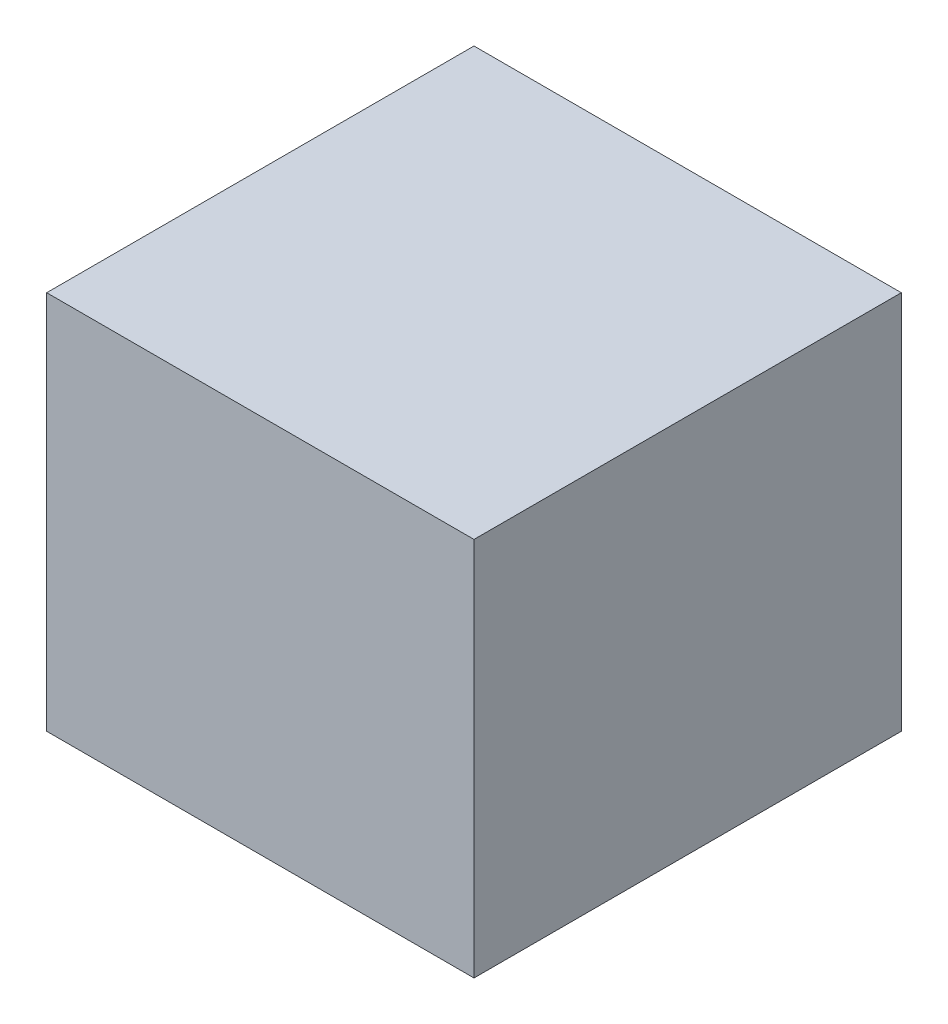
ISO-10303-21;
HEADER;
FILE_DESCRIPTION(('STEP AP214'),'2;1');
FILE_NAME('part.step','',(''),(''),'','','');
FILE_SCHEMA(('AUTOMOTIVE_DESIGN { 1 0 10303 214 1 1 1 1 }'));
ENDSEC;
DATA;
#1=APPLICATION_CONTEXT('core data for automotive mechanical design processes');
#2=APPLICATION_PROTOCOL_DEFINITION('international standard','automotive_design',2000,#1);
#3=PRODUCT_CONTEXT('',#1,'mechanical');
#4=PRODUCT('Part','Part','',(#3));
#5=PRODUCT_RELATED_PRODUCT_CATEGORY('part','',(#4));
#6=PRODUCT_DEFINITION_FORMATION('','',#4);
#7=PRODUCT_DEFINITION_CONTEXT('part definition',#1,'design');
#8=PRODUCT_DEFINITION('design','',#6,#7);
#9=PRODUCT_DEFINITION_SHAPE('','',#8);
#10=(LENGTH_UNIT() NAMED_UNIT(*) SI_UNIT(.MILLI.,.METRE.));
#11=(NAMED_UNIT(*) PLANE_ANGLE_UNIT() SI_UNIT($,.RADIAN.));
#12=(NAMED_UNIT(*) SI_UNIT($,.STERADIAN.) SOLID_ANGLE_UNIT());
#13=UNCERTAINTY_MEASURE_WITH_UNIT(LENGTH_MEASURE(1.E-05),#10,'distance_accuracy_value','');
#14=(GEOMETRIC_REPRESENTATION_CONTEXT(3) GLOBAL_UNCERTAINTY_ASSIGNED_CONTEXT((#13)) GLOBAL_UNIT_ASSIGNED_CONTEXT((#10,
#11,#12)) REPRESENTATION_CONTEXT('',''));
#15=CARTESIAN_POINT('',(0.,0.,0.));
#16=DIRECTION('',(0.,0.,1.));
#17=DIRECTION('',(1.,0.,0.));
#18=AXIS2_PLACEMENT_3D('',#15,#16,#17);
#19=CARTESIAN_POINT('',(0.,160.,-180.));
#20=DIRECTION('',(1.,0.,0.));
#21=DIRECTION('',(0.,0.,-1.));
#22=AXIS2_PLACEMENT_3D('',#19,#20,#21);
#23=PLANE('',#22);
#24=DIRECTION('',(0.,0.,1.));
#25=VECTOR('',#24,1.);
#26=CARTESIAN_POINT('',(0.,0.,-180.));
#27=LINE('',#26,#25);
#28=CARTESIAN_POINT('',(0.,0.,-180.));
#29=VERTEX_POINT('',#28);
#30=CARTESIAN_POINT('',(0.,0.,0.));
#31=VERTEX_POINT('',#30);
#32=EDGE_CURVE('E113',#29,#31,#27,.T.);
#33=ORIENTED_EDGE('',*,*,#32,.T.);
#34=DIRECTION('',(0.,-1.,0.));
#35=VECTOR('',#34,1.);
#36=CARTESIAN_POINT('',(0.,160.,0.));
#37=LINE('',#36,#35);
#38=CARTESIAN_POINT('',(0.,160.,0.));
#39=VERTEX_POINT('',#38);
#40=EDGE_CURVE('E11',#39,#31,#37,.T.);
#41=ORIENTED_EDGE('',*,*,#40,.F.);
#42=DIRECTION('',(0.,0.,1.));
#43=VECTOR('',#42,1.);
#44=CARTESIAN_POINT('',(0.,160.,-180.));
#45=LINE('',#44,#43);
#46=CARTESIAN_POINT('',(0.,160.,-180.));
#47=VERTEX_POINT('',#46);
#48=EDGE_CURVE('E97',#47,#39,#45,.T.);
#49=ORIENTED_EDGE('',*,*,#48,.F.);
#50=DIRECTION('',(0.,-1.,0.));
#51=VECTOR('',#50,1.);
#52=CARTESIAN_POINT('',(0.,160.,-180.));
#53=LINE('',#52,#51);
#54=EDGE_CURVE('E109',#47,#29,#53,.T.);
#55=ORIENTED_EDGE('',*,*,#54,.T.);
#56=EDGE_LOOP('',(#33,#41,#49,#55));
#57=FACE_BOUND('',#56,.T.);
#58=ADVANCED_FACE('F45',(#57),#23,.F.);
#59=CARTESIAN_POINT('',(0.,160.,0.));
#60=DIRECTION('',(0.,0.,-1.));
#61=DIRECTION('',(-1.,0.,0.));
#62=AXIS2_PLACEMENT_3D('',#59,#60,#61);
#63=PLANE('',#62);
#64=DIRECTION('',(1.,0.,0.));
#65=VECTOR('',#64,1.);
#66=CARTESIAN_POINT('',(0.,0.,0.));
#67=LINE('',#66,#65);
#68=CARTESIAN_POINT('',(180.,0.,0.));
#69=VERTEX_POINT('',#68);
#70=EDGE_CURVE('E102',#31,#69,#67,.T.);
#71=ORIENTED_EDGE('',*,*,#70,.T.);
#72=DIRECTION('',(0.,-1.,0.));
#73=VECTOR('',#72,1.);
#74=CARTESIAN_POINT('',(180.,160.,0.));
#75=LINE('',#74,#73);
#76=CARTESIAN_POINT('',(180.,160.,0.));
#77=VERTEX_POINT('',#76);
#78=EDGE_CURVE('E54',#77,#69,#75,.T.);
#79=ORIENTED_EDGE('',*,*,#78,.F.);
#80=DIRECTION('',(1.,0.,0.));
#81=VECTOR('',#80,1.);
#82=CARTESIAN_POINT('',(0.,160.,0.));
#83=LINE('',#82,#81);
#84=EDGE_CURVE('E92',#39,#77,#83,.T.);
#85=ORIENTED_EDGE('',*,*,#84,.F.);
#86=ORIENTED_EDGE('',*,*,#40,.T.);
#87=EDGE_LOOP('',(#71,#79,#85,#86));
#88=FACE_BOUND('',#87,.T.);
#89=ADVANCED_FACE('F101',(#88),#63,.F.);
#90=CARTESIAN_POINT('',(180.,160.,0.));
#91=DIRECTION('',(-1.,0.,0.));
#92=DIRECTION('',(0.,0.,1.));
#93=AXIS2_PLACEMENT_3D('',#90,#91,#92);
#94=PLANE('',#93);
#95=DIRECTION('',(0.,0.,-1.));
#96=VECTOR('',#95,1.);
#97=CARTESIAN_POINT('',(180.,0.,0.));
#98=LINE('',#97,#96);
#99=CARTESIAN_POINT('',(180.,0.,-180.));
#100=VERTEX_POINT('',#99);
#101=EDGE_CURVE('E79',#69,#100,#98,.T.);
#102=ORIENTED_EDGE('',*,*,#101,.T.);
#103=DIRECTION('',(0.,-1.,0.));
#104=VECTOR('',#103,1.);
#105=CARTESIAN_POINT('',(180.,160.,-180.));
#106=LINE('',#105,#104);
#107=CARTESIAN_POINT('',(180.,160.,-180.));
#108=VERTEX_POINT('',#107);
#109=EDGE_CURVE('E104',#108,#100,#106,.T.);
#110=ORIENTED_EDGE('',*,*,#109,.F.);
#111=DIRECTION('',(0.,0.,-1.));
#112=VECTOR('',#111,1.);
#113=CARTESIAN_POINT('',(180.,160.,0.));
#114=LINE('',#113,#112);
#115=EDGE_CURVE('E95',#77,#108,#114,.T.);
#116=ORIENTED_EDGE('',*,*,#115,.F.);
#117=ORIENTED_EDGE('',*,*,#78,.T.);
#118=EDGE_LOOP('',(#102,#110,#116,#117));
#119=FACE_BOUND('',#118,.T.);
#120=ADVANCED_FACE('F105',(#119),#94,.F.);
#121=CARTESIAN_POINT('',(180.,160.,-180.));
#122=DIRECTION('',(0.,0.,1.));
#123=DIRECTION('',(1.,0.,0.));
#124=AXIS2_PLACEMENT_3D('',#121,#122,#123);
#125=PLANE('',#124);
#126=DIRECTION('',(-1.,0.,0.));
#127=VECTOR('',#126,1.);
#128=CARTESIAN_POINT('',(180.,0.,-180.));
#129=LINE('',#128,#127);
#130=EDGE_CURVE('E85',#100,#29,#129,.T.);
#131=ORIENTED_EDGE('',*,*,#130,.T.);
#132=ORIENTED_EDGE('',*,*,#54,.F.);
#133=DIRECTION('',(-1.,0.,0.));
#134=VECTOR('',#133,1.);
#135=CARTESIAN_POINT('',(180.,160.,-180.));
#136=LINE('',#135,#134);
#137=EDGE_CURVE('E62',#108,#47,#136,.T.);
#138=ORIENTED_EDGE('',*,*,#137,.F.);
#139=ORIENTED_EDGE('',*,*,#109,.T.);
#140=EDGE_LOOP('',(#131,#132,#138,#139));
#141=FACE_BOUND('',#140,.T.);
#142=ADVANCED_FACE('F126',(#141),#125,.F.);
#143=CARTESIAN_POINT('',(0.,160.,0.));
#144=DIRECTION('',(0.,1.,0.));
#145=DIRECTION('',(0.,0.,1.));
#146=AXIS2_PLACEMENT_3D('',#143,#144,#145);
#147=PLANE('',#146);
#148=ORIENTED_EDGE('',*,*,#48,.T.);
#149=ORIENTED_EDGE('',*,*,#84,.T.);
#150=ORIENTED_EDGE('',*,*,#115,.T.);
#151=ORIENTED_EDGE('',*,*,#137,.T.);
#152=EDGE_LOOP('',(#148,#149,#150,#151));
#153=FACE_BOUND('',#152,.T.);
#154=ADVANCED_FACE('F93',(#153),#147,.T.);
#155=CARTESIAN_POINT('',(0.,0.,0.));
#156=DIRECTION('',(0.,1.,0.));
#157=DIRECTION('',(0.,0.,1.));
#158=AXIS2_PLACEMENT_3D('',#155,#156,#157);
#159=PLANE('',#158);
#160=ORIENTED_EDGE('',*,*,#32,.F.);
#161=ORIENTED_EDGE('',*,*,#130,.F.);
#162=ORIENTED_EDGE('',*,*,#101,.F.);
#163=ORIENTED_EDGE('',*,*,#70,.F.);
#164=EDGE_LOOP('',(#160,#161,#162,#163));
#165=FACE_BOUND('',#164,.T.);
#166=ADVANCED_FACE('F129',(#165),#159,.F.);
#167=CLOSED_SHELL('',(#58,#89,#120,#142,#154,#166));
#168=MANIFOLD_SOLID_BREP('B2',#167);
#169=ADVANCED_BREP_SHAPE_REPRESENTATION('',(#18,#168),#14);
#170=SHAPE_DEFINITION_REPRESENTATION(#9,#169);
ENDSEC;
END-ISO-10303-21;
